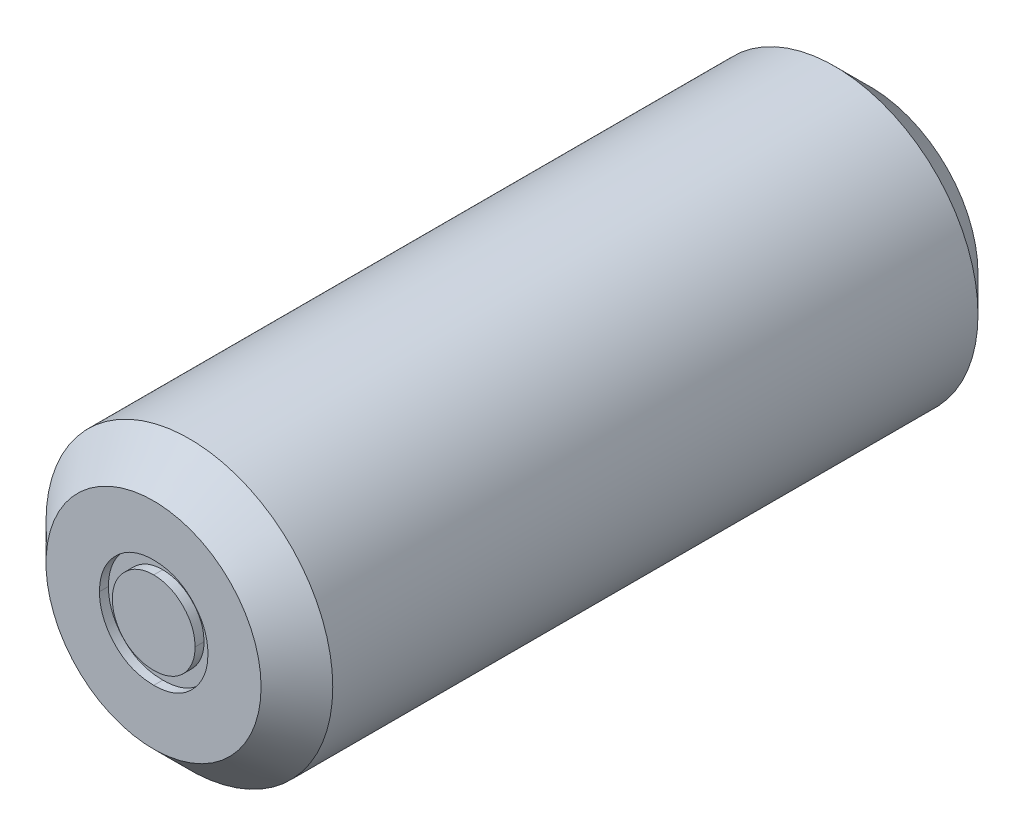
ISO-10303-21;
HEADER;
FILE_DESCRIPTION(('STEP AP214'),'2;1');
FILE_NAME('part.step','',(''),(''),'','','');
FILE_SCHEMA(('AUTOMOTIVE_DESIGN { 1 0 10303 214 1 1 1 1 }'));
ENDSEC;
DATA;
#1=APPLICATION_CONTEXT('core data for automotive mechanical design processes');
#2=APPLICATION_PROTOCOL_DEFINITION('international standard','automotive_design',2000,#1);
#3=PRODUCT_CONTEXT('',#1,'mechanical');
#4=PRODUCT('Part','Part','',(#3));
#5=PRODUCT_RELATED_PRODUCT_CATEGORY('part','',(#4));
#6=PRODUCT_DEFINITION_FORMATION('','',#4);
#7=PRODUCT_DEFINITION_CONTEXT('part definition',#1,'design');
#8=PRODUCT_DEFINITION('design','',#6,#7);
#9=PRODUCT_DEFINITION_SHAPE('','',#8);
#10=(LENGTH_UNIT() NAMED_UNIT(*) SI_UNIT(.MILLI.,.METRE.));
#11=(NAMED_UNIT(*) PLANE_ANGLE_UNIT() SI_UNIT($,.RADIAN.));
#12=(NAMED_UNIT(*) SI_UNIT($,.STERADIAN.) SOLID_ANGLE_UNIT());
#13=UNCERTAINTY_MEASURE_WITH_UNIT(LENGTH_MEASURE(1.E-05),#10,'distance_accuracy_value','');
#14=(GEOMETRIC_REPRESENTATION_CONTEXT(3) GLOBAL_UNCERTAINTY_ASSIGNED_CONTEXT((#13)) GLOBAL_UNIT_ASSIGNED_CONTEXT((#10,
#11,#12)) REPRESENTATION_CONTEXT('',''));
#15=CARTESIAN_POINT('',(0.,0.,0.));
#16=DIRECTION('',(0.,0.,1.));
#17=DIRECTION('',(1.,0.,0.));
#18=AXIS2_PLACEMENT_3D('',#15,#16,#17);
#19=CARTESIAN_POINT('',(0.,0.,10.));
#20=DIRECTION('',(0.,0.,1.));
#21=DIRECTION('',(1.,0.,0.));
#22=AXIS2_PLACEMENT_3D('',#19,#20,#21);
#23=PLANE('',#22);
#24=CARTESIAN_POINT('',(0.,0.,10.));
#25=DIRECTION('',(0.,0.,1.));
#26=DIRECTION('',(1.,0.,0.));
#27=AXIS2_PLACEMENT_3D('',#24,#25,#26);
#28=CIRCLE('',#27,3.);
#29=CARTESIAN_POINT('',(3.,0.,10.));
#30=VERTEX_POINT('',#29);
#31=EDGE_CURVE('E11',#30,#30,#28,.T.);
#32=ORIENTED_EDGE('',*,*,#31,.T.);
#33=EDGE_LOOP('',(#32));
#34=FACE_BOUND('',#33,.T.);
#35=CARTESIAN_POINT('',(-1.50824850684948,0.0502986479706245,10.));
#36=CARTESIAN_POINT('',(-1.50696472358818,0.0992318432768139,10.));
#37=CARTESIAN_POINT('',(-1.50442305336199,0.196111160316235,10.));
#38=CARTESIAN_POINT('',(-1.48577104299135,0.338884943917538,10.));
#39=CARTESIAN_POINT('',(-1.45450412129481,0.476824817134202,10.));
#40=CARTESIAN_POINT('',(-1.41023966820388,0.609311075401275,10.));
#41=CARTESIAN_POINT('',(-1.35365087861372,0.737031573732336,10.));
#42=CARTESIAN_POINT('',(-1.28466654953465,0.859779952002417,10.));
#43=CARTESIAN_POINT('',(-1.20262011234551,0.977480295406729,10.));
#44=CARTESIAN_POINT('',(-1.13953216773713,1.05030552972451,10.));
#45=CARTESIAN_POINT('',(-1.10760748120845,1.0871576223296,10.));
#46=B_SPLINE_CURVE_WITH_KNOTS('',3,(#35,#36,#37,#38,#39,#40,#41,#42,#43,#44,#45),.UNSPECIFIED.,
.F.,.F.,(4,1,1,1,1,1,1,1,4),(0.,0.128919131811961,0.255237724924907,0.378678595978551,
0.501087887185132,0.622713679429777,0.746240794938383,0.87158904723167,1.),.UNSPECIFIED.);
#47=CARTESIAN_POINT('',(-1.50824850684948,0.0502986479706245,10.));
#48=VERTEX_POINT('',#47);
#49=CARTESIAN_POINT('',(-1.10760748120845,1.0871576223296,10.));
#50=VERTEX_POINT('',#49);
#51=EDGE_CURVE('E228',#48,#50,#46,.T.);
#52=ORIENTED_EDGE('',*,*,#51,.T.);
#53=CARTESIAN_POINT('',(-1.10760748120845,1.0871576223296,10.));
#54=CARTESIAN_POINT('',(-1.07052337717871,1.12598612433362,10.));
#55=CARTESIAN_POINT('',(-0.997590961350294,1.20234920571968,9.99999999999999));
#56=CARTESIAN_POINT('',(-0.874906701089495,1.30010066181905,10.));
#57=CARTESIAN_POINT('',(-0.7463423341061,1.38457617480285,10.));
#58=CARTESIAN_POINT('',(-0.609513847091798,1.45254899246306,10.));
#59=CARTESIAN_POINT('',(-0.465876295142345,1.50607872700752,10.));
#60=CARTESIAN_POINT('',(-0.314768589396193,1.54329645856736,10.));
#61=CARTESIAN_POINT('',(-0.156739428871046,1.56758600710336,10.));
#62=CARTESIAN_POINT('',(-0.0486712904760947,1.56993821030958,10.));
#63=CARTESIAN_POINT('',(0.00617457007359799,1.57113198130396,10.));
#64=B_SPLINE_CURVE_WITH_KNOTS('',3,(#53,#54,#55,#56,#57,#58,#59,#60,#61,#62,#63),.UNSPECIFIED.,
.F.,.F.,(4,1,1,1,1,1,1,1,4),(0.,0.128497521137512,0.252712985515452,0.374819132567045,
0.49643642637273,0.617910556745851,0.74128761730929,0.868700400744607,1.),.UNSPECIFIED.);
#65=CARTESIAN_POINT('',(0.00617457007359799,1.57113198130396,10.));
#66=VERTEX_POINT('',#65);
#67=EDGE_CURVE('E59',#50,#66,#64,.T.);
#68=ORIENTED_EDGE('',*,*,#67,.T.);
#69=CARTESIAN_POINT('',(0.00617457007359799,1.57113198130396,10.));
#70=CARTESIAN_POINT('',(0.0610217390373204,1.56996410571671,10.));
#71=CARTESIAN_POINT('',(0.168563633402718,1.56767418710453,10.));
#72=CARTESIAN_POINT('',(0.326058360121961,1.54319994064439,10.));
#73=CARTESIAN_POINT('',(0.476395658334888,1.50577438134655,10.));
#74=CARTESIAN_POINT('',(0.62015130652177,1.45403545326145,10.));
#75=CARTESIAN_POINT('',(0.755484215610625,1.3846846526367,10.));
#76=CARTESIAN_POINT('',(0.8843656374483,1.30193117706478,10.));
#77=CARTESIAN_POINT('',(1.00644221903106,1.20389392727699,10.));
#78=CARTESIAN_POINT('',(1.079611395325,1.12805613484872,10.));
#79=CARTESIAN_POINT('',(1.11675149315052,1.08956146848344,10.));
#80=B_SPLINE_CURVE_WITH_KNOTS('',3,(#69,#70,#71,#72,#73,#74,#75,#76,#77,#78,#79),.UNSPECIFIED.,
.F.,.F.,(4,1,1,1,1,1,1,1,4),(0.,0.131751427302405,0.258332350514159,0.382133976092545,
0.503804391600085,0.624692986540932,0.746870589727577,0.871513504234816,1.),.UNSPECIFIED.);
#81=CARTESIAN_POINT('',(1.11675149315052,1.08956146848344,10.));
#82=VERTEX_POINT('',#81);
#83=EDGE_CURVE('E196',#66,#82,#80,.T.);
#84=ORIENTED_EDGE('',*,*,#83,.T.);
#85=CARTESIAN_POINT('',(1.11675149315052,1.08956146848344,10.));
#86=CARTESIAN_POINT('',(1.14873086922475,1.05274548472409,10.));
#87=CARTESIAN_POINT('',(1.21207073235392,0.979826007906584,10.));
#88=CARTESIAN_POINT('',(1.29328869668462,0.861591021663856,10.));
#89=CARTESIAN_POINT('',(1.3632561940074,0.739145192416246,10.));
#90=CARTESIAN_POINT('',(1.41932814942077,0.610862533363369,10.));
#91=CARTESIAN_POINT('',(1.46353960506101,0.47786290918786,10.));
#92=CARTESIAN_POINT('',(1.49492897220993,0.339689182149252,10.));
#93=CARTESIAN_POINT('',(1.51359975499897,0.196646499676602,10.));
#94=CARTESIAN_POINT('',(1.51611743150371,0.0994992561599949,10.));
#95=CARTESIAN_POINT('',(1.51739251879155,0.0502986479706245,10.));
#96=B_SPLINE_CURVE_WITH_KNOTS('',3,(#85,#86,#87,#88,#89,#90,#91,#92,#93,#94,#95),.UNSPECIFIED.,
.F.,.F.,(4,1,1,1,1,1,1,1,4),(0.,0.128157279593187,0.253834362796735,0.376505622522209,
0.49853368566791,0.621367728732464,0.744564744904358,0.870633798255284,1.),.UNSPECIFIED.);
#97=CARTESIAN_POINT('',(1.51739251879155,0.0502986479706245,10.));
#98=VERTEX_POINT('',#97);
#99=EDGE_CURVE('E204',#82,#98,#96,.T.);
#100=ORIENTED_EDGE('',*,*,#99,.T.);
#101=CARTESIAN_POINT('',(1.51739251879155,0.0502986479706245,10.));
#102=CARTESIAN_POINT('',(1.51627099042823,0.000812867767534148,10.));
#103=CARTESIAN_POINT('',(1.51405479807848,-0.0969733417434879,10.));
#104=CARTESIAN_POINT('',(1.49309066506012,-0.240995474073175,10.));
#105=CARTESIAN_POINT('',(1.46048370977182,-0.380646699999329,10.));
#106=CARTESIAN_POINT('',(1.41381875185291,-0.515342350002274,10.));
#107=CARTESIAN_POINT('',(1.35398091269458,-0.645494152758131,10.));
#108=CARTESIAN_POINT('',(1.28096298408477,-0.770533637659749,10.));
#109=CARTESIAN_POINT('',(1.19425256448282,-0.890707504257591,10.));
#110=CARTESIAN_POINT('',(1.09596228247321,-1.0049953194032,10.));
#111=CARTESIAN_POINT('',(0.987331566871626,-1.11032813631001,10.));
#112=CARTESIAN_POINT('',(0.869484540221262,-1.20213187294238,10.));
#113=CARTESIAN_POINT('',(0.744737073077357,-1.28078504364914,10.));
#114=CARTESIAN_POINT('',(0.611430383620578,-1.34414094720887,10.));
#115=CARTESIAN_POINT('',(0.470781827241437,-1.39409489042205,10.));
#116=CARTESIAN_POINT('',(0.322488035121364,-1.42918062348536,10.));
#117=CARTESIAN_POINT('',(0.166779383334814,-1.45039397637264,10.));
#118=CARTESIAN_POINT('',(0.0604625589163135,-1.4531180600994,10.));
#119=CARTESIAN_POINT('',(0.00617457007359799,-1.45450904433707,10.));
#120=B_SPLINE_CURVE_WITH_KNOTS('',3,(#101,#102,#103,#104,#105,#106,#107,#108,#109,#110,#111,
#112,#113,#114,#115,#116,#117,#118,#119),.UNSPECIFIED.,.F.,.F.,(4,1,1,1,1,1,1,1,1,1,1,1,1,1,1,1,
4),(0.,0.0624160261588177,0.12333697853733,0.183265139853092,0.243172443069709,
0.302898353919745,0.36377359750391,0.425605304952382,0.489659042510184,0.553784576792116,
0.616221532811073,0.677854471308342,0.739516897487938,0.802096535576371,0.865865841277971,
0.931507795196511,1.),.UNSPECIFIED.);
#121=CARTESIAN_POINT('',(0.00617457007359799,-1.45450904433707,10.));
#122=VERTEX_POINT('',#121);
#123=EDGE_CURVE('E212',#98,#122,#120,.T.);
#124=ORIENTED_EDGE('',*,*,#123,.T.);
#125=CARTESIAN_POINT('',(0.00617457007359799,-1.45450904433707,10.));
#126=CARTESIAN_POINT('',(-0.0483793950794853,-1.45311339151685,10.));
#127=CARTESIAN_POINT('',(-0.155226091906745,-1.45037993495985,10.));
#128=CARTESIAN_POINT('',(-0.311484356961897,-1.42926304041177,10.));
#129=CARTESIAN_POINT('',(-0.460043921458887,-1.39411106033237,10.));
#130=CARTESIAN_POINT('',(-0.600876605481065,-1.34397678292666,10.));
#131=CARTESIAN_POINT('',(-0.734756430572609,-1.2807830186416,10.));
#132=CARTESIAN_POINT('',(-0.860226712800473,-1.20236965912369,10.));
#133=CARTESIAN_POINT('',(-0.978169473390032,-1.11030091027976,10.));
#134=CARTESIAN_POINT('',(-1.08682316986534,-1.0050026965085,10.));
#135=CARTESIAN_POINT('',(-1.18510729023801,-0.890705603562543,10.));
#136=CARTESIAN_POINT('',(-1.27181929978226,-0.770534130998515,10.));
#137=CARTESIAN_POINT('',(-1.34483681538231,-0.645494024213121,10.));
#138=CARTESIAN_POINT('',(-1.40467476267615,-0.515342384280823,10.));
#139=CARTESIAN_POINT('',(-1.45133969172542,-0.380646690807814,10.));
#140=CARTESIAN_POINT('',(-1.48394665477493,-0.240995476568003,10.));
#141=CARTESIAN_POINT('',(-1.5049107857074,-0.0969733410975164,10.));
#142=CARTESIAN_POINT('',(-1.50712697834201,0.000812867984591019,10.));
#143=CARTESIAN_POINT('',(-1.50824850684948,0.0502986479706245,10.));
#144=B_SPLINE_CURVE_WITH_KNOTS('',3,(#125,#126,#127,#128,#129,#130,#131,#132,#133,#134,#135,
#136,#137,#138,#139,#140,#141,#142,#143),.UNSPECIFIED.,.F.,.F.,(4,1,1,1,1,1,1,1,1,1,1,1,1,1,1,1,
4),(0.,0.0687422616054889,0.134635192224277,0.198324187067147,0.260825012560421,
0.322713588159025,0.384554534607619,0.446912857724756,0.510957632514829,0.574930701001336,
0.636684537796093,0.697483115294062,0.757133807523855,0.816965663675264,0.876818351657196,
0.937662580384003,1.),.UNSPECIFIED.);
#145=EDGE_CURVE('E220',#122,#48,#144,.T.);
#146=ORIENTED_EDGE('',*,*,#145,.T.);
#147=EDGE_LOOP('',(#52,#68,#84,#100,#124,#146));
#148=FACE_BOUND('',#147,.T.);
#149=ADVANCED_FACE('F43',(#34,#148),#23,.T.);
#150=CARTESIAN_POINT('',(0.,0.,10.));
#151=DIRECTION('',(0.,0.,-1.));
#152=DIRECTION('',(-1.,0.,0.));
#153=AXIS2_PLACEMENT_3D('',#150,#151,#152);
#154=CYLINDRICAL_SURFACE('',#153,4.);
#155=CARTESIAN_POINT('',(0.,0.,-8.99999999999999));
#156=DIRECTION('',(0.,0.,1.));
#157=DIRECTION('',(1.,0.,0.));
#158=AXIS2_PLACEMENT_3D('',#155,#156,#157);
#159=CIRCLE('',#158,4.);
#160=CARTESIAN_POINT('',(4.,0.,-8.99999999999999));
#161=VERTEX_POINT('',#160);
#162=EDGE_CURVE('E254',#161,#161,#159,.T.);
#163=ORIENTED_EDGE('',*,*,#162,.T.);
#164=EDGE_LOOP('',(#163));
#165=FACE_BOUND('',#164,.T.);
#166=CARTESIAN_POINT('',(0.,0.,9.));
#167=DIRECTION('',(0.,0.,1.));
#168=DIRECTION('',(1.,0.,0.));
#169=AXIS2_PLACEMENT_3D('',#166,#167,#168);
#170=CIRCLE('',#169,4.);
#171=CARTESIAN_POINT('',(4.,0.,9.));
#172=VERTEX_POINT('',#171);
#173=EDGE_CURVE('E251',#172,#172,#170,.F.);
#174=ORIENTED_EDGE('',*,*,#173,.T.);
#175=EDGE_LOOP('',(#174));
#176=FACE_BOUND('',#175,.T.);
#177=ADVANCED_FACE('F266',(#165,#176),#154,.T.);
#178=CARTESIAN_POINT('',(0.,0.,-10.));
#179=DIRECTION('',(0.,0.,1.));
#180=DIRECTION('',(1.,0.,0.));
#181=AXIS2_PLACEMENT_3D('',#178,#179,#180);
#182=PLANE('',#181);
#183=CARTESIAN_POINT('',(0.,0.,-10.));
#184=DIRECTION('',(0.,0.,1.));
#185=DIRECTION('',(1.,0.,0.));
#186=AXIS2_PLACEMENT_3D('',#183,#184,#185);
#187=CIRCLE('',#186,2.99999999999999);
#188=CARTESIAN_POINT('',(2.99999999999999,0.,-10.));
#189=VERTEX_POINT('',#188);
#190=EDGE_CURVE('E52',#189,#189,#187,.F.);
#191=ORIENTED_EDGE('',*,*,#190,.T.);
#192=EDGE_LOOP('',(#191));
#193=FACE_BOUND('',#192,.T.);
#194=ADVANCED_FACE('F259',(#193),#182,.F.);
#195=CARTESIAN_POINT('',(0.,0.,-8.99999999999999));
#196=DIRECTION('',(0.,0.,1.));
#197=DIRECTION('',(1.,0.,0.));
#198=AXIS2_PLACEMENT_3D('',#195,#196,#197);
#199=CONICAL_SURFACE('',#198,4.,0.78539816339745);
#200=ORIENTED_EDGE('',*,*,#190,.F.);
#201=EDGE_LOOP('',(#200));
#202=FACE_BOUND('',#201,.T.);
#203=ORIENTED_EDGE('',*,*,#162,.F.);
#204=EDGE_LOOP('',(#203));
#205=FACE_BOUND('',#204,.T.);
#206=ADVANCED_FACE('F261',(#202,#205),#199,.T.);
#207=CARTESIAN_POINT('',(0.,0.,10.));
#208=DIRECTION('',(0.,0.,-1.));
#209=DIRECTION('',(-1.,0.,0.));
#210=AXIS2_PLACEMENT_3D('',#207,#208,#209);
#211=CONICAL_SURFACE('',#210,3.,0.785398163397447);
#212=ORIENTED_EDGE('',*,*,#173,.F.);
#213=EDGE_LOOP('',(#212));
#214=FACE_BOUND('',#213,.T.);
#215=ORIENTED_EDGE('',*,*,#31,.F.);
#216=EDGE_LOOP('',(#215));
#217=FACE_BOUND('',#216,.T.);
#218=ADVANCED_FACE('F46',(#214,#217),#211,.T.);
#219=CARTESIAN_POINT('',(-1.10760748120845,1.0871576223296,9.75));
#220=CARTESIAN_POINT('',(-1.07052337717871,1.12598612433362,9.75));
#221=CARTESIAN_POINT('',(-0.997590961350294,1.20234920571968,9.74999999999999));
#222=CARTESIAN_POINT('',(-0.874906701089495,1.30010066181905,9.75));
#223=CARTESIAN_POINT('',(-0.7463423341061,1.38457617480285,9.75));
#224=CARTESIAN_POINT('',(-0.609513847091798,1.45254899246306,9.75));
#225=CARTESIAN_POINT('',(-0.465876295142345,1.50607872700752,9.75));
#226=CARTESIAN_POINT('',(-0.314768589396193,1.54329645856736,9.75));
#227=CARTESIAN_POINT('',(-0.156739428871046,1.56758600710336,9.75));
#228=CARTESIAN_POINT('',(-0.0486712904760947,1.56993821030958,9.75));
#229=CARTESIAN_POINT('',(0.00617457007359799,1.57113198130396,9.75));
#230=B_SPLINE_CURVE_WITH_KNOTS('',3,(#219,#220,#221,#222,#223,#224,#225,#226,#227,#228,#229),
.UNSPECIFIED.,.F.,.F.,(4,1,1,1,1,1,1,1,4),(0.,0.128497521137512,0.252712985515452,
0.374819132567045,0.49643642637273,0.617910556745851,0.74128761730929,0.868700400744607,1.),.UNSPECIFIED.);
#231=DIRECTION('',(0.,0.,1.));
#232=VECTOR('',#231,1.);
#233=SURFACE_OF_LINEAR_EXTRUSION('',#230,#232);
#234=ORIENTED_EDGE('',*,*,#67,.F.);
#235=DIRECTION('',(0.,0.,1.));
#236=VECTOR('',#235,1.);
#237=CARTESIAN_POINT('',(-1.10760748120845,1.0871576223296,9.75));
#238=LINE('',#237,#236);
#239=CARTESIAN_POINT('',(-1.10760748120845,1.0871576223296,9.75));
#240=VERTEX_POINT('',#239);
#241=EDGE_CURVE('E184',#240,#50,#238,.T.);
#242=ORIENTED_EDGE('',*,*,#241,.F.);
#243=CARTESIAN_POINT('',(0.00617457007359799,1.57113198130396,9.75));
#244=VERTEX_POINT('',#243);
#245=EDGE_CURVE('E236',#240,#244,#230,.T.);
#246=ORIENTED_EDGE('',*,*,#245,.T.);
#247=DIRECTION('',(0.,0.,1.));
#248=VECTOR('',#247,1.);
#249=CARTESIAN_POINT('',(0.00617457007359799,1.57113198130396,9.75));
#250=LINE('',#249,#248);
#251=EDGE_CURVE('E249',#244,#66,#250,.T.);
#252=ORIENTED_EDGE('',*,*,#251,.T.);
#253=EDGE_LOOP('',(#234,#242,#246,#252));
#254=FACE_BOUND('',#253,.T.);
#255=ADVANCED_FACE('F274',(#254),#233,.T.);
#256=CARTESIAN_POINT('',(0.00617457007359799,1.57113198130396,9.75));
#257=CARTESIAN_POINT('',(0.0610217390373204,1.56996410571671,9.75));
#258=CARTESIAN_POINT('',(0.168563633402718,1.56767418710453,9.75));
#259=CARTESIAN_POINT('',(0.326058360121961,1.54319994064439,9.75));
#260=CARTESIAN_POINT('',(0.476395658334888,1.50577438134655,9.75));
#261=CARTESIAN_POINT('',(0.62015130652177,1.45403545326145,9.75));
#262=CARTESIAN_POINT('',(0.755484215610625,1.3846846526367,9.75));
#263=CARTESIAN_POINT('',(0.8843656374483,1.30193117706478,9.75));
#264=CARTESIAN_POINT('',(1.00644221903106,1.20389392727699,9.75));
#265=CARTESIAN_POINT('',(1.079611395325,1.12805613484872,9.75));
#266=CARTESIAN_POINT('',(1.11675149315052,1.08956146848344,9.75));
#267=B_SPLINE_CURVE_WITH_KNOTS('',3,(#256,#257,#258,#259,#260,#261,#262,#263,#264,#265,#266),
.UNSPECIFIED.,.F.,.F.,(4,1,1,1,1,1,1,1,4),(0.,0.131751427302405,0.258332350514159,
0.382133976092545,0.503804391600085,0.624692986540932,0.746870589727577,0.871513504234816,1.),.UNSPECIFIED.);
#268=DIRECTION('',(0.,0.,1.));
#269=VECTOR('',#268,1.);
#270=SURFACE_OF_LINEAR_EXTRUSION('',#267,#269);
#271=ORIENTED_EDGE('',*,*,#83,.F.);
#272=ORIENTED_EDGE('',*,*,#251,.F.);
#273=CARTESIAN_POINT('',(1.11675149315052,1.08956146848344,9.75));
#274=VERTEX_POINT('',#273);
#275=EDGE_CURVE('E290',#244,#274,#267,.T.);
#276=ORIENTED_EDGE('',*,*,#275,.T.);
#277=DIRECTION('',(0.,0.,1.));
#278=VECTOR('',#277,1.);
#279=CARTESIAN_POINT('',(1.11675149315052,1.08956146848344,9.75));
#280=LINE('',#279,#278);
#281=EDGE_CURVE('E247',#274,#82,#280,.T.);
#282=ORIENTED_EDGE('',*,*,#281,.T.);
#283=EDGE_LOOP('',(#271,#272,#276,#282));
#284=FACE_BOUND('',#283,.T.);
#285=ADVANCED_FACE('F308',(#284),#270,.T.);
#286=CARTESIAN_POINT('',(1.11675149315052,1.08956146848344,9.75));
#287=CARTESIAN_POINT('',(1.14873086922475,1.05274548472409,9.75));
#288=CARTESIAN_POINT('',(1.21207073235392,0.979826007906584,9.75));
#289=CARTESIAN_POINT('',(1.29328869668462,0.861591021663856,9.75));
#290=CARTESIAN_POINT('',(1.3632561940074,0.739145192416246,9.75));
#291=CARTESIAN_POINT('',(1.41932814942077,0.610862533363369,9.75));
#292=CARTESIAN_POINT('',(1.46353960506101,0.47786290918786,9.75));
#293=CARTESIAN_POINT('',(1.49492897220993,0.339689182149252,9.75));
#294=CARTESIAN_POINT('',(1.51359975499897,0.196646499676602,9.75));
#295=CARTESIAN_POINT('',(1.51611743150371,0.0994992561599949,9.75));
#296=CARTESIAN_POINT('',(1.51739251879155,0.0502986479706245,9.75));
#297=B_SPLINE_CURVE_WITH_KNOTS('',3,(#286,#287,#288,#289,#290,#291,#292,#293,#294,#295,#296),
.UNSPECIFIED.,.F.,.F.,(4,1,1,1,1,1,1,1,4),(0.,0.128157279593187,0.253834362796735,
0.376505622522209,0.49853368566791,0.621367728732464,0.744564744904358,0.870633798255284,1.),.UNSPECIFIED.);
#298=DIRECTION('',(0.,0.,1.));
#299=VECTOR('',#298,1.);
#300=SURFACE_OF_LINEAR_EXTRUSION('',#297,#299);
#301=ORIENTED_EDGE('',*,*,#99,.F.);
#302=ORIENTED_EDGE('',*,*,#281,.F.);
#303=CARTESIAN_POINT('',(1.51739251879155,0.0502986479706245,9.75));
#304=VERTEX_POINT('',#303);
#305=EDGE_CURVE('E292',#274,#304,#297,.T.);
#306=ORIENTED_EDGE('',*,*,#305,.T.);
#307=DIRECTION('',(0.,0.,1.));
#308=VECTOR('',#307,1.);
#309=CARTESIAN_POINT('',(1.51739251879155,0.0502986479706245,9.75));
#310=LINE('',#309,#308);
#311=EDGE_CURVE('E245',#304,#98,#310,.T.);
#312=ORIENTED_EDGE('',*,*,#311,.T.);
#313=EDGE_LOOP('',(#301,#302,#306,#312));
#314=FACE_BOUND('',#313,.T.);
#315=ADVANCED_FACE('F349',(#314),#300,.T.);
#316=CARTESIAN_POINT('',(1.51739251879155,0.0502986479706245,9.75));
#317=CARTESIAN_POINT('',(1.51627099042823,0.000812867767534148,9.75));
#318=CARTESIAN_POINT('',(1.51405479807848,-0.0969733417434879,9.75));
#319=CARTESIAN_POINT('',(1.49309066506012,-0.240995474073175,9.75));
#320=CARTESIAN_POINT('',(1.46048370977182,-0.380646699999329,9.75));
#321=CARTESIAN_POINT('',(1.41381875185291,-0.515342350002274,9.75));
#322=CARTESIAN_POINT('',(1.35398091269458,-0.645494152758131,9.75));
#323=CARTESIAN_POINT('',(1.28096298408477,-0.770533637659749,9.75000000000001));
#324=CARTESIAN_POINT('',(1.19425256448282,-0.890707504257591,9.75));
#325=CARTESIAN_POINT('',(1.09596228247321,-1.0049953194032,9.75));
#326=CARTESIAN_POINT('',(0.987331566871626,-1.11032813631001,9.75));
#327=CARTESIAN_POINT('',(0.869484540221262,-1.20213187294238,9.75));
#328=CARTESIAN_POINT('',(0.744737073077357,-1.28078504364914,9.75));
#329=CARTESIAN_POINT('',(0.611430383620578,-1.34414094720887,9.75));
#330=CARTESIAN_POINT('',(0.470781827241437,-1.39409489042205,9.75));
#331=CARTESIAN_POINT('',(0.322488035121364,-1.42918062348536,9.75));
#332=CARTESIAN_POINT('',(0.166779383334814,-1.45039397637264,9.75));
#333=CARTESIAN_POINT('',(0.0604625589163135,-1.4531180600994,9.75));
#334=CARTESIAN_POINT('',(0.00617457007359799,-1.45450904433707,9.75));
#335=B_SPLINE_CURVE_WITH_KNOTS('',3,(#316,#317,#318,#319,#320,#321,#322,#323,#324,#325,#326,
#327,#328,#329,#330,#331,#332,#333,#334),.UNSPECIFIED.,.F.,.F.,(4,1,1,1,1,1,1,1,1,1,1,1,1,1,1,1,
4),(0.,0.0624160261588177,0.12333697853733,0.183265139853092,0.243172443069709,
0.302898353919745,0.36377359750391,0.425605304952382,0.489659042510184,0.553784576792116,
0.616221532811073,0.677854471308342,0.739516897487938,0.802096535576371,0.865865841277971,
0.931507795196511,1.),.UNSPECIFIED.);
#336=DIRECTION('',(0.,0.,1.));
#337=VECTOR('',#336,1.);
#338=SURFACE_OF_LINEAR_EXTRUSION('',#335,#337);
#339=ORIENTED_EDGE('',*,*,#123,.F.);
#340=ORIENTED_EDGE('',*,*,#311,.F.);
#341=CARTESIAN_POINT('',(0.00617457007359799,-1.45450904433707,9.75));
#342=VERTEX_POINT('',#341);
#343=EDGE_CURVE('E483',#304,#342,#335,.T.);
#344=ORIENTED_EDGE('',*,*,#343,.T.);
#345=DIRECTION('',(0.,0.,1.));
#346=VECTOR('',#345,1.);
#347=CARTESIAN_POINT('',(0.00617457007359799,-1.45450904433707,9.75));
#348=LINE('',#347,#346);
#349=EDGE_CURVE('E243',#342,#122,#348,.T.);
#350=ORIENTED_EDGE('',*,*,#349,.T.);
#351=EDGE_LOOP('',(#339,#340,#344,#350));
#352=FACE_BOUND('',#351,.T.);
#353=ADVANCED_FACE('F357',(#352),#338,.T.);
#354=CARTESIAN_POINT('',(0.00617457007359799,-1.45450904433707,9.75));
#355=CARTESIAN_POINT('',(-0.0483793950794853,-1.45311339151685,9.75));
#356=CARTESIAN_POINT('',(-0.155226091906745,-1.45037993495985,9.75));
#357=CARTESIAN_POINT('',(-0.311484356961897,-1.42926304041177,9.75));
#358=CARTESIAN_POINT('',(-0.460043921458887,-1.39411106033237,9.75));
#359=CARTESIAN_POINT('',(-0.600876605481065,-1.34397678292666,9.75));
#360=CARTESIAN_POINT('',(-0.734756430572609,-1.2807830186416,9.75));
#361=CARTESIAN_POINT('',(-0.860226712800473,-1.20236965912369,9.75));
#362=CARTESIAN_POINT('',(-0.978169473390032,-1.11030091027976,9.75));
#363=CARTESIAN_POINT('',(-1.08682316986534,-1.0050026965085,9.75));
#364=CARTESIAN_POINT('',(-1.18510729023801,-0.890705603562543,9.75));
#365=CARTESIAN_POINT('',(-1.27181929978226,-0.770534130998515,9.75));
#366=CARTESIAN_POINT('',(-1.34483681538231,-0.645494024213121,9.75));
#367=CARTESIAN_POINT('',(-1.40467476267615,-0.515342384280823,9.75));
#368=CARTESIAN_POINT('',(-1.45133969172542,-0.380646690807814,9.75));
#369=CARTESIAN_POINT('',(-1.48394665477493,-0.240995476568003,9.75));
#370=CARTESIAN_POINT('',(-1.5049107857074,-0.0969733410975164,9.75));
#371=CARTESIAN_POINT('',(-1.50712697834201,0.000812867984591019,9.75));
#372=CARTESIAN_POINT('',(-1.50824850684948,0.0502986479706245,9.75));
#373=B_SPLINE_CURVE_WITH_KNOTS('',3,(#354,#355,#356,#357,#358,#359,#360,#361,#362,#363,#364,
#365,#366,#367,#368,#369,#370,#371,#372),.UNSPECIFIED.,.F.,.F.,(4,1,1,1,1,1,1,1,1,1,1,1,1,1,1,1,
4),(0.,0.0687422616054889,0.134635192224277,0.198324187067147,0.260825012560421,
0.322713588159025,0.384554534607619,0.446912857724756,0.510957632514829,0.574930701001336,
0.636684537796093,0.697483115294062,0.757133807523855,0.816965663675264,0.876818351657196,
0.937662580384003,1.),.UNSPECIFIED.);
#374=DIRECTION('',(0.,0.,1.));
#375=VECTOR('',#374,1.);
#376=SURFACE_OF_LINEAR_EXTRUSION('',#373,#375);
#377=ORIENTED_EDGE('',*,*,#145,.F.);
#378=ORIENTED_EDGE('',*,*,#349,.F.);
#379=CARTESIAN_POINT('',(-1.50824850684948,0.0502986479706245,9.75));
#380=VERTEX_POINT('',#379);
#381=EDGE_CURVE('E185',#342,#380,#373,.T.);
#382=ORIENTED_EDGE('',*,*,#381,.T.);
#383=DIRECTION('',(0.,0.,1.));
#384=VECTOR('',#383,1.);
#385=CARTESIAN_POINT('',(-1.50824850684948,0.0502986479706245,9.75));
#386=LINE('',#385,#384);
#387=EDGE_CURVE('E241',#380,#48,#386,.T.);
#388=ORIENTED_EDGE('',*,*,#387,.T.);
#389=EDGE_LOOP('',(#377,#378,#382,#388));
#390=FACE_BOUND('',#389,.T.);
#391=ADVANCED_FACE('F175',(#390),#376,.T.);
#392=CARTESIAN_POINT('',(-1.50824850684948,0.0502986479706245,9.75));
#393=CARTESIAN_POINT('',(-1.50696472358818,0.0992318432768139,9.75));
#394=CARTESIAN_POINT('',(-1.50442305336199,0.196111160316235,9.75));
#395=CARTESIAN_POINT('',(-1.48577104299135,0.338884943917538,9.75));
#396=CARTESIAN_POINT('',(-1.45450412129481,0.476824817134202,9.75));
#397=CARTESIAN_POINT('',(-1.41023966820388,0.609311075401275,9.75));
#398=CARTESIAN_POINT('',(-1.35365087861372,0.737031573732336,9.75));
#399=CARTESIAN_POINT('',(-1.28466654953465,0.859779952002417,9.75));
#400=CARTESIAN_POINT('',(-1.20262011234551,0.977480295406729,9.75));
#401=CARTESIAN_POINT('',(-1.13953216773713,1.05030552972451,9.75));
#402=CARTESIAN_POINT('',(-1.10760748120845,1.0871576223296,9.75));
#403=B_SPLINE_CURVE_WITH_KNOTS('',3,(#392,#393,#394,#395,#396,#397,#398,#399,#400,#401,#402),
.UNSPECIFIED.,.F.,.F.,(4,1,1,1,1,1,1,1,4),(0.,0.128919131811961,0.255237724924907,
0.378678595978551,0.501087887185132,0.622713679429777,0.746240794938383,0.87158904723167,1.),.UNSPECIFIED.);
#404=DIRECTION('',(0.,0.,1.));
#405=VECTOR('',#404,1.);
#406=SURFACE_OF_LINEAR_EXTRUSION('',#403,#405);
#407=ORIENTED_EDGE('',*,*,#51,.F.);
#408=ORIENTED_EDGE('',*,*,#387,.F.);
#409=EDGE_CURVE('E179',#380,#240,#403,.T.);
#410=ORIENTED_EDGE('',*,*,#409,.T.);
#411=ORIENTED_EDGE('',*,*,#241,.T.);
#412=EDGE_LOOP('',(#407,#408,#410,#411));
#413=FACE_BOUND('',#412,.T.);
#414=ADVANCED_FACE('F171',(#413),#406,.T.);
#415=CARTESIAN_POINT('',(-0.604308143552718,1.45190768253273,9.75));
#416=DIRECTION('',(-4.4273798870189E-13,4.67524219838171E-13,1.));
#417=DIRECTION('',(0.,-1.,4.67524219838171E-13));
#418=AXIS2_PLACEMENT_3D('',#415,#416,#417);
#419=PLANE('',#418);
#420=CARTESIAN_POINT('',(0.00457200597103399,-1.09553468536271,9.75));
#421=CARTESIAN_POINT('',(0.0562592847518729,-1.09403722220025,9.75));
#422=CARTESIAN_POINT('',(0.158288537295709,-1.09108127151408,9.75));
#423=CARTESIAN_POINT('',(0.307384739391614,-1.06168833468277,9.75));
#424=CARTESIAN_POINT('',(0.45014356438433,-1.01585557959202,9.75));
#425=CARTESIAN_POINT('',(0.585265150117875,-0.951944482590298,9.75));
#426=CARTESIAN_POINT('',(0.710484125470866,-0.870787437139181,9.75000000000001));
#427=CARTESIAN_POINT('',(0.824025978411442,-0.774288720483751,9.75));
#428=CARTESIAN_POINT('',(0.922024391136061,-0.660672890366667,9.75));
#429=CARTESIAN_POINT('',(1.0058342253168,-0.534321428857498,9.75));
#430=CARTESIAN_POINT('',(1.07388764555679,-0.397996455036867,9.75));
#431=CARTESIAN_POINT('',(1.12323987617559,-0.254235915257023,9.75));
#432=CARTESIAN_POINT('',(1.15295140289767,-0.104770724496345,9.75));
#433=CARTESIAN_POINT('',(1.15658663572844,-0.00325263222518807,9.75));
#434=CARTESIAN_POINT('',(1.15841815981719,0.0478948018167783,9.75));
#435=B_SPLINE_CURVE_WITH_KNOTS('',3,(#420,#421,#422,#423,#424,#425,#426,#427,#428,#429,#430,
#431,#432,#433,#434),.UNSPECIFIED.,.F.,.F.,(4,1,1,1,1,1,1,1,1,1,1,1,4),(0.,0.085605694973527,
0.168983263922235,0.25090758232979,0.333708096114323,0.416004984256339,0.49765956757438,
0.579893285641965,0.663902321042856,0.748466253808259,0.831790886479856,0.915251908831687,1.),.UNSPECIFIED.);
#436=CARTESIAN_POINT('',(0.00457200597103399,-1.09553468536271,9.75));
#437=VERTEX_POINT('',#436);
#438=CARTESIAN_POINT('',(1.15841815981719,0.0478948018167783,9.75));
#439=VERTEX_POINT('',#438);
#440=EDGE_CURVE('E135',#437,#439,#435,.T.);
#441=ORIENTED_EDGE('',*,*,#440,.F.);
#442=CARTESIAN_POINT('',(-1.14927414787512,0.0478948018167783,9.75));
#443=CARTESIAN_POINT('',(-1.14743777800595,-0.00325037208022407,9.75));
#444=CARTESIAN_POINT('',(-1.1437929272072,-0.104763978386263,9.75));
#445=CARTESIAN_POINT('',(-1.11415265699571,-0.254262404256616,9.75));
#446=CARTESIAN_POINT('',(-1.06456833713014,-0.397784520963739,9.75));
#447=CARTESIAN_POINT('',(-0.997611446033911,-0.534488962155109,9.75));
#448=CARTESIAN_POINT('',(-0.913718624684685,-0.660971565627903,9.75));
#449=CARTESIAN_POINT('',(-0.814876262768887,-0.773738976317965,9.75));
#450=CARTESIAN_POINT('',(-0.702145176639838,-0.871094189400771,9.75));
#451=CARTESIAN_POINT('',(-0.576869176417697,-0.951872298611247,9.75));
#452=CARTESIAN_POINT('',(-0.441607098804299,-1.01605487654848,9.75));
#453=CARTESIAN_POINT('',(-0.298457017537335,-1.06153942022468,9.75));
#454=CARTESIAN_POINT('',(-0.149153367199381,-1.09110706867868,9.75));
#455=CARTESIAN_POINT('',(-0.0471182458859062,-1.09404589651281,9.75));
#456=CARTESIAN_POINT('',(0.00457200597103399,-1.09553468536271,9.75));
#457=B_SPLINE_CURVE_WITH_KNOTS('',3,(#442,#443,#444,#445,#446,#447,#448,#449,#450,#451,#452,
#453,#454,#455,#456),.UNSPECIFIED.,.F.,.F.,(4,1,1,1,1,1,1,1,1,1,1,1,4),(0.,0.0847327446980153,
0.168178653646313,0.25148819761228,0.335840671389491,0.419834494150796,0.50234487598801,
0.58364901973244,0.665931005276273,0.748716525264391,0.831047336137363,0.914409806794561,1.),.UNSPECIFIED.);
#458=CARTESIAN_POINT('',(-1.14927414787512,0.0478948018167783,9.75));
#459=VERTEX_POINT('',#458);
#460=EDGE_CURVE('E145',#459,#437,#457,.T.);
#461=ORIENTED_EDGE('',*,*,#460,.F.);
#462=CARTESIAN_POINT('',(0.00457200597103399,1.2121576223296,9.75));
#463=CARTESIAN_POINT('',(-0.0342138355395332,1.21105523184472,9.75));
#464=CARTESIAN_POINT('',(-0.110784268302786,1.20887890890795,9.75));
#465=CARTESIAN_POINT('',(-0.223492365111952,1.19232587495337,9.75));
#466=CARTESIAN_POINT('',(-0.331995398177471,1.16610015601798,9.75));
#467=CARTESIAN_POINT('',(-0.436499220042011,1.12883837743527,9.75));
#468=CARTESIAN_POINT('',(-0.536651417089325,1.08072535010813,9.75));
#469=CARTESIAN_POINT('',(-0.632547876978603,1.02163008130661,9.75));
#470=CARTESIAN_POINT('',(-0.724470665444867,0.952335273902035,9.75));
#471=CARTESIAN_POINT('',(-0.81062159500035,0.872949363490558,9.75));
#472=CARTESIAN_POINT('',(-0.889687094614433,0.786230512588223,9.75));
#473=CARTESIAN_POINT('',(-0.958804782152756,0.69383238814824,9.75));
#474=CARTESIAN_POINT('',(-1.01757633229101,0.597253706689383,9.75));
#475=CARTESIAN_POINT('',(-1.06653651393436,0.496394036815139,9.74999999999999));
#476=CARTESIAN_POINT('',(-1.10300187175786,0.390231278069216,9.75));
#477=CARTESIAN_POINT('',(-1.12948532602639,0.27996769952406,9.75));
#478=CARTESIAN_POINT('',(-1.14602274369828,0.165378652115993,9.75));
#479=CARTESIAN_POINT('',(-1.14817860494148,0.087480345481112,9.75));
#480=CARTESIAN_POINT('',(-1.14927414787512,0.0478948018167783,9.75));
#481=B_SPLINE_CURVE_WITH_KNOTS('',3,(#462,#463,#464,#465,#466,#467,#468,#469,#470,#471,#472,
#473,#474,#475,#476,#477,#478,#479,#480),.UNSPECIFIED.,.F.,.F.,(4,1,1,1,1,1,1,1,1,1,1,1,1,1,1,1,
4),(0.,0.0638458997347871,0.126043627840844,0.187165357719568,0.247399289521263,
0.308380030604164,0.36977961666405,0.432583924686935,0.497640785995257,0.562401136962062,
0.625557103333041,0.687332004620173,0.748312745703073,0.809791039122615,0.871767571972928,
0.934836190950315,1.),.UNSPECIFIED.);
#482=CARTESIAN_POINT('',(0.00457200597103399,1.2121576223296,9.75));
#483=VERTEX_POINT('',#482);
#484=EDGE_CURVE('E127',#483,#459,#481,.T.);
#485=ORIENTED_EDGE('',*,*,#484,.F.);
#486=CARTESIAN_POINT('',(1.15841815981719,0.0478948018167783,9.75));
#487=CARTESIAN_POINT('',(1.15732299407323,0.0874805820582978,9.75));
#488=CARTESIAN_POINT('',(1.15516787508175,0.165379354240964,9.75));
#489=CARTESIAN_POINT('',(1.13862505864742,0.279965015490614,9.75));
#490=CARTESIAN_POINT('',(1.11216158474638,0.390241125924384,9.75));
#491=CARTESIAN_POINT('',(1.07562259359889,0.496357701104618,9.75));
#492=CARTESIAN_POINT('',(1.02687514920058,0.597514848900994,9.75));
#493=CARTESIAN_POINT('',(0.966970242826078,0.693548822680534,9.75));
#494=CARTESIAN_POINT('',(0.898134785218113,0.786550589597514,9.75));
#495=CARTESIAN_POINT('',(0.818115218477446,0.872669036212044,9.75));
#496=CARTESIAN_POINT('',(0.732054215183799,0.952366220867124,9.75));
#497=CARTESIAN_POINT('',(0.640094171546921,1.02165695160939,9.74999999999999));
#498=CARTESIAN_POINT('',(0.544339910309055,1.08046563217564,9.75000000000001));
#499=CARTESIAN_POINT('',(0.444478672982126,1.12924990711558,9.75));
#500=CARTESIAN_POINT('',(0.339961452813643,1.16576115320235,9.75));
#501=CARTESIAN_POINT('',(0.231610448035542,1.19247730349169,9.75));
#502=CARTESIAN_POINT('',(0.119383236675918,1.20880895678635,9.75000000000001));
#503=CARTESIAN_POINT('',(0.0430871873499839,1.21103426131357,9.75));
#504=CARTESIAN_POINT('',(0.00457200597103399,1.2121576223296,9.75));
#505=B_SPLINE_CURVE_WITH_KNOTS('',3,(#486,#487,#488,#489,#490,#491,#492,#493,#494,#495,#496,
#497,#498,#499,#500,#501,#502,#503,#504),.UNSPECIFIED.,.F.,.F.,(4,1,1,1,1,1,1,1,1,1,1,1,1,1,1,1,
4),(0.,0.0651847959860721,0.128273727113927,0.190270220392757,0.251768313775683,
0.312768694578124,0.374793279409787,0.437969586062712,0.503047399863371,0.568125213664031,
0.630949748712263,0.692369109386702,0.752973167750262,0.813641066917747,0.874355208691815,
0.936572968465483,1.),.UNSPECIFIED.);
#506=EDGE_CURVE('E142',#439,#483,#505,.T.);
#507=ORIENTED_EDGE('',*,*,#506,.F.);
#508=EDGE_LOOP('',(#441,#461,#485,#507));
#509=FACE_BOUND('',#508,.T.);
#510=ORIENTED_EDGE('',*,*,#245,.F.);
#511=ORIENTED_EDGE('',*,*,#409,.F.);
#512=ORIENTED_EDGE('',*,*,#381,.F.);
#513=ORIENTED_EDGE('',*,*,#343,.F.);
#514=ORIENTED_EDGE('',*,*,#305,.F.);
#515=ORIENTED_EDGE('',*,*,#275,.F.);
#516=EDGE_LOOP('',(#510,#511,#512,#513,#514,#515));
#517=FACE_BOUND('',#516,.T.);
#518=ADVANCED_FACE('F140',(#509,#517),#419,.T.);
#519=DIRECTION('',(0.,0.,1.));
#520=VECTOR('',#519,1.);
#521=SURFACE_OF_LINEAR_EXTRUSION('',#505,#520);
#522=CARTESIAN_POINT('',(1.15841815981719,0.0478948018167783,10.));
#523=CARTESIAN_POINT('',(1.15732299407323,0.0874805820582978,10.));
#524=CARTESIAN_POINT('',(1.15516787508175,0.165379354240964,10.));
#525=CARTESIAN_POINT('',(1.13862505864742,0.279965015490614,10.));
#526=CARTESIAN_POINT('',(1.11216158474638,0.390241125924384,10.));
#527=CARTESIAN_POINT('',(1.07562259359889,0.496357701104618,10.));
#528=CARTESIAN_POINT('',(1.02687514920058,0.597514848900994,10.));
#529=CARTESIAN_POINT('',(0.966970242826078,0.693548822680534,10.));
#530=CARTESIAN_POINT('',(0.898134785218113,0.786550589597514,10.));
#531=CARTESIAN_POINT('',(0.818115218477446,0.872669036212044,10.));
#532=CARTESIAN_POINT('',(0.732054215183799,0.952366220867124,10.));
#533=CARTESIAN_POINT('',(0.640094171546921,1.02165695160939,9.99999999999999));
#534=CARTESIAN_POINT('',(0.544339910309055,1.08046563217564,10.));
#535=CARTESIAN_POINT('',(0.444478672982126,1.12924990711558,10.));
#536=CARTESIAN_POINT('',(0.339961452813643,1.16576115320235,10.));
#537=CARTESIAN_POINT('',(0.231610448035542,1.19247730349169,10.));
#538=CARTESIAN_POINT('',(0.119383236675918,1.20880895678635,10.));
#539=CARTESIAN_POINT('',(0.0430871873499839,1.21103426131357,10.));
#540=CARTESIAN_POINT('',(0.00457200597103399,1.2121576223296,10.));
#541=B_SPLINE_CURVE_WITH_KNOTS('',3,(#522,#523,#524,#525,#526,#527,#528,#529,#530,#531,#532,
#533,#534,#535,#536,#537,#538,#539,#540),.UNSPECIFIED.,.F.,.F.,(4,1,1,1,1,1,1,1,1,1,1,1,1,1,1,1,
4),(0.,0.0651847959860721,0.128273727113927,0.190270220392757,0.251768313775683,
0.312768694578124,0.374793279409787,0.437969586062712,0.503047399863371,0.568125213664031,
0.630949748712263,0.692369109386702,0.752973167750262,0.813641066917747,0.874355208691815,
0.936572968465483,1.),.UNSPECIFIED.);
#542=CARTESIAN_POINT('',(1.15841815981719,0.0478948018167783,10.));
#543=VERTEX_POINT('',#542);
#544=CARTESIAN_POINT('',(0.00457200597103399,1.2121576223296,10.));
#545=VERTEX_POINT('',#544);
#546=EDGE_CURVE('E427',#543,#545,#541,.T.);
#547=ORIENTED_EDGE('',*,*,#546,.F.);
#548=DIRECTION('',(0.,0.,1.));
#549=VECTOR('',#548,1.);
#550=CARTESIAN_POINT('',(1.15841815981719,0.0478948018167783,9.75));
#551=LINE('',#550,#549);
#552=EDGE_CURVE('E148',#439,#543,#551,.T.);
#553=ORIENTED_EDGE('',*,*,#552,.F.);
#554=ORIENTED_EDGE('',*,*,#506,.T.);
#555=DIRECTION('',(0.,0.,1.));
#556=VECTOR('',#555,1.);
#557=CARTESIAN_POINT('',(0.00457200597103399,1.2121576223296,9.75));
#558=LINE('',#557,#556);
#559=EDGE_CURVE('E124',#483,#545,#558,.T.);
#560=ORIENTED_EDGE('',*,*,#559,.T.);
#561=EDGE_LOOP('',(#547,#553,#554,#560));
#562=FACE_BOUND('',#561,.T.);
#563=ADVANCED_FACE('F147',(#562),#521,.T.);
#564=DIRECTION('',(0.,0.,1.));
#565=VECTOR('',#564,1.);
#566=SURFACE_OF_LINEAR_EXTRUSION('',#435,#565);
#567=CARTESIAN_POINT('',(0.00457200597103399,-1.09553468536271,10.));
#568=CARTESIAN_POINT('',(0.0562592847518729,-1.09403722220025,10.));
#569=CARTESIAN_POINT('',(0.158288537295709,-1.09108127151408,10.));
#570=CARTESIAN_POINT('',(0.307384739391614,-1.06168833468277,10.));
#571=CARTESIAN_POINT('',(0.45014356438433,-1.01585557959202,10.));
#572=CARTESIAN_POINT('',(0.585265150117875,-0.951944482590298,10.));
#573=CARTESIAN_POINT('',(0.710484125470866,-0.870787437139181,10.));
#574=CARTESIAN_POINT('',(0.824025978411442,-0.774288720483751,10.));
#575=CARTESIAN_POINT('',(0.922024391136061,-0.660672890366667,10.));
#576=CARTESIAN_POINT('',(1.0058342253168,-0.534321428857498,10.));
#577=CARTESIAN_POINT('',(1.07388764555679,-0.397996455036867,10.));
#578=CARTESIAN_POINT('',(1.12323987617559,-0.254235915257023,10.));
#579=CARTESIAN_POINT('',(1.15295140289767,-0.104770724496345,10.));
#580=CARTESIAN_POINT('',(1.15658663572844,-0.00325263222518807,10.));
#581=CARTESIAN_POINT('',(1.15841815981719,0.0478948018167783,10.));
#582=B_SPLINE_CURVE_WITH_KNOTS('',3,(#567,#568,#569,#570,#571,#572,#573,#574,#575,#576,#577,
#578,#579,#580,#581),.UNSPECIFIED.,.F.,.F.,(4,1,1,1,1,1,1,1,1,1,1,1,4),(0.,0.085605694973527,
0.168983263922235,0.25090758232979,0.333708096114323,0.416004984256339,0.49765956757438,
0.579893285641965,0.663902321042856,0.748466253808259,0.831790886479856,0.915251908831687,1.),.UNSPECIFIED.);
#583=CARTESIAN_POINT('',(0.00457200597103399,-1.09553468536271,10.));
#584=VERTEX_POINT('',#583);
#585=EDGE_CURVE('E149',#584,#543,#582,.T.);
#586=ORIENTED_EDGE('',*,*,#585,.F.);
#587=DIRECTION('',(0.,0.,1.));
#588=VECTOR('',#587,1.);
#589=CARTESIAN_POINT('',(0.00457200597103399,-1.09553468536271,9.75));
#590=LINE('',#589,#588);
#591=EDGE_CURVE('E428',#437,#584,#590,.T.);
#592=ORIENTED_EDGE('',*,*,#591,.F.);
#593=ORIENTED_EDGE('',*,*,#440,.T.);
#594=ORIENTED_EDGE('',*,*,#552,.T.);
#595=EDGE_LOOP('',(#586,#592,#593,#594));
#596=FACE_BOUND('',#595,.T.);
#597=ADVANCED_FACE('F167',(#596),#566,.T.);
#598=DIRECTION('',(0.,0.,1.));
#599=VECTOR('',#598,1.);
#600=SURFACE_OF_LINEAR_EXTRUSION('',#457,#599);
#601=CARTESIAN_POINT('',(-1.14927414787512,0.0478948018167783,10.));
#602=CARTESIAN_POINT('',(-1.14743777800595,-0.00325037208022407,10.));
#603=CARTESIAN_POINT('',(-1.1437929272072,-0.104763978386263,10.));
#604=CARTESIAN_POINT('',(-1.11415265699571,-0.254262404256616,10.));
#605=CARTESIAN_POINT('',(-1.06456833713014,-0.397784520963739,10.));
#606=CARTESIAN_POINT('',(-0.997611446033911,-0.534488962155109,10.));
#607=CARTESIAN_POINT('',(-0.913718624684685,-0.660971565627903,10.));
#608=CARTESIAN_POINT('',(-0.814876262768887,-0.773738976317965,10.));
#609=CARTESIAN_POINT('',(-0.702145176639838,-0.871094189400771,10.));
#610=CARTESIAN_POINT('',(-0.576869176417697,-0.951872298611247,10.));
#611=CARTESIAN_POINT('',(-0.441607098804299,-1.01605487654848,10.));
#612=CARTESIAN_POINT('',(-0.298457017537335,-1.06153942022468,10.));
#613=CARTESIAN_POINT('',(-0.149153367199381,-1.09110706867868,10.));
#614=CARTESIAN_POINT('',(-0.0471182458859062,-1.09404589651281,10.));
#615=CARTESIAN_POINT('',(0.00457200597103399,-1.09553468536271,10.));
#616=B_SPLINE_CURVE_WITH_KNOTS('',3,(#601,#602,#603,#604,#605,#606,#607,#608,#609,#610,#611,
#612,#613,#614,#615),.UNSPECIFIED.,.F.,.F.,(4,1,1,1,1,1,1,1,1,1,1,1,4),(0.,0.0847327446980153,
0.168178653646313,0.25148819761228,0.335840671389491,0.419834494150796,0.50234487598801,
0.58364901973244,0.665931005276273,0.748716525264391,0.831047336137363,0.914409806794561,1.),.UNSPECIFIED.);
#617=CARTESIAN_POINT('',(-1.14927414787512,0.0478948018167783,10.));
#618=VERTEX_POINT('',#617);
#619=EDGE_CURVE('E67',#618,#584,#616,.T.);
#620=ORIENTED_EDGE('',*,*,#619,.F.);
#621=DIRECTION('',(0.,0.,1.));
#622=VECTOR('',#621,1.);
#623=CARTESIAN_POINT('',(-1.14927414787512,0.0478948018167783,9.75));
#624=LINE('',#623,#622);
#625=EDGE_CURVE('E134',#459,#618,#624,.T.);
#626=ORIENTED_EDGE('',*,*,#625,.F.);
#627=ORIENTED_EDGE('',*,*,#460,.T.);
#628=ORIENTED_EDGE('',*,*,#591,.T.);
#629=EDGE_LOOP('',(#620,#626,#627,#628));
#630=FACE_BOUND('',#629,.T.);
#631=ADVANCED_FACE('F394',(#630),#600,.T.);
#632=DIRECTION('',(0.,0.,1.));
#633=VECTOR('',#632,1.);
#634=SURFACE_OF_LINEAR_EXTRUSION('',#481,#633);
#635=CARTESIAN_POINT('',(0.00457200597103399,1.2121576223296,10.));
#636=CARTESIAN_POINT('',(-0.0342138355395332,1.21105523184472,10.));
#637=CARTESIAN_POINT('',(-0.110784268302786,1.20887890890795,10.));
#638=CARTESIAN_POINT('',(-0.223492365111952,1.19232587495337,10.));
#639=CARTESIAN_POINT('',(-0.331995398177471,1.16610015601798,10.));
#640=CARTESIAN_POINT('',(-0.436499220042011,1.12883837743527,10.));
#641=CARTESIAN_POINT('',(-0.536651417089325,1.08072535010813,10.));
#642=CARTESIAN_POINT('',(-0.632547876978603,1.02163008130661,10.));
#643=CARTESIAN_POINT('',(-0.724470665444867,0.952335273902035,10.));
#644=CARTESIAN_POINT('',(-0.81062159500035,0.872949363490558,10.));
#645=CARTESIAN_POINT('',(-0.889687094614433,0.786230512588223,10.));
#646=CARTESIAN_POINT('',(-0.958804782152756,0.69383238814824,10.));
#647=CARTESIAN_POINT('',(-1.01757633229101,0.597253706689383,10.));
#648=CARTESIAN_POINT('',(-1.06653651393436,0.496394036815139,9.99999999999999));
#649=CARTESIAN_POINT('',(-1.10300187175786,0.390231278069216,10.));
#650=CARTESIAN_POINT('',(-1.12948532602639,0.27996769952406,10.));
#651=CARTESIAN_POINT('',(-1.14602274369828,0.165378652115993,10.));
#652=CARTESIAN_POINT('',(-1.14817860494148,0.087480345481112,10.));
#653=CARTESIAN_POINT('',(-1.14927414787512,0.0478948018167783,10.));
#654=B_SPLINE_CURVE_WITH_KNOTS('',3,(#635,#636,#637,#638,#639,#640,#641,#642,#643,#644,#645,
#646,#647,#648,#649,#650,#651,#652,#653),.UNSPECIFIED.,.F.,.F.,(4,1,1,1,1,1,1,1,1,1,1,1,1,1,1,1,
4),(0.,0.0638458997347871,0.126043627840844,0.187165357719568,0.247399289521263,
0.308380030604164,0.36977961666405,0.432583924686935,0.497640785995257,0.562401136962062,
0.625557103333041,0.687332004620173,0.748312745703073,0.809791039122615,0.871767571972928,
0.934836190950315,1.),.UNSPECIFIED.);
#655=EDGE_CURVE('E129',#545,#618,#654,.T.);
#656=ORIENTED_EDGE('',*,*,#655,.F.);
#657=ORIENTED_EDGE('',*,*,#559,.F.);
#658=ORIENTED_EDGE('',*,*,#484,.T.);
#659=ORIENTED_EDGE('',*,*,#625,.T.);
#660=EDGE_LOOP('',(#656,#657,#658,#659));
#661=FACE_BOUND('',#660,.T.);
#662=ADVANCED_FACE('F126',(#661),#634,.T.);
#663=ORIENTED_EDGE('',*,*,#585,.T.);
#664=ORIENTED_EDGE('',*,*,#546,.T.);
#665=ORIENTED_EDGE('',*,*,#655,.T.);
#666=ORIENTED_EDGE('',*,*,#619,.T.);
#667=EDGE_LOOP('',(#663,#664,#665,#666));
#668=FACE_BOUND('',#667,.T.);
#669=ADVANCED_FACE('F280',(#668),#23,.T.);
#670=CLOSED_SHELL('',(#149,#177,#194,#206,#218,#255,#285,#315,#353,#391,#414,#518,#563,#597,
#631,#662,#669));
#671=MANIFOLD_SOLID_BREP('B2',#670);
#672=ADVANCED_BREP_SHAPE_REPRESENTATION('',(#18,#671),#14);
#673=SHAPE_DEFINITION_REPRESENTATION(#9,#672);
ENDSEC;
END-ISO-10303-21;
